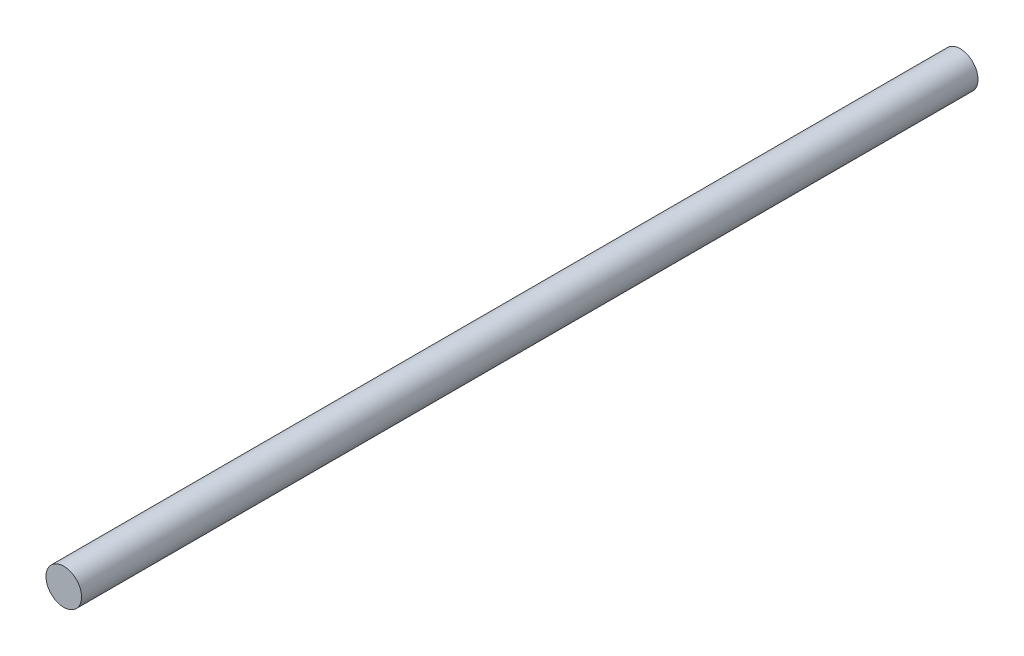
ISO-10303-21;
HEADER;
FILE_DESCRIPTION(('STEP AP214'),'2;1');
FILE_NAME('part.step','',(''),(''),'','','');
FILE_SCHEMA(('AUTOMOTIVE_DESIGN { 1 0 10303 214 1 1 1 1 }'));
ENDSEC;
DATA;
#1=APPLICATION_CONTEXT('core data for automotive mechanical design processes');
#2=APPLICATION_PROTOCOL_DEFINITION('international standard','automotive_design',2000,#1);
#3=PRODUCT_CONTEXT('',#1,'mechanical');
#4=PRODUCT('Part','Part','',(#3));
#5=PRODUCT_RELATED_PRODUCT_CATEGORY('part','',(#4));
#6=PRODUCT_DEFINITION_FORMATION('','',#4);
#7=PRODUCT_DEFINITION_CONTEXT('part definition',#1,'design');
#8=PRODUCT_DEFINITION('design','',#6,#7);
#9=PRODUCT_DEFINITION_SHAPE('','',#8);
#10=(LENGTH_UNIT() NAMED_UNIT(*) SI_UNIT(.MILLI.,.METRE.));
#11=(NAMED_UNIT(*) PLANE_ANGLE_UNIT() SI_UNIT($,.RADIAN.));
#12=(NAMED_UNIT(*) SI_UNIT($,.STERADIAN.) SOLID_ANGLE_UNIT());
#13=UNCERTAINTY_MEASURE_WITH_UNIT(LENGTH_MEASURE(1.E-05),#10,'distance_accuracy_value','');
#14=(GEOMETRIC_REPRESENTATION_CONTEXT(3) GLOBAL_UNCERTAINTY_ASSIGNED_CONTEXT((#13)) GLOBAL_UNIT_ASSIGNED_CONTEXT((#10,
#11,#12)) REPRESENTATION_CONTEXT('',''));
#15=CARTESIAN_POINT('',(0.,0.,0.));
#16=DIRECTION('',(0.,0.,1.));
#17=DIRECTION('',(1.,0.,0.));
#18=AXIS2_PLACEMENT_3D('',#15,#16,#17);
#19=CARTESIAN_POINT('',(0.,0.,151.));
#20=DIRECTION('',(0.,0.,-1.));
#21=DIRECTION('',(-1.,0.,0.));
#22=AXIS2_PLACEMENT_3D('',#19,#20,#21);
#23=CYLINDRICAL_SURFACE('',#22,3.);
#24=CARTESIAN_POINT('',(0.,0.,151.));
#25=DIRECTION('',(0.,0.,1.));
#26=DIRECTION('',(1.,0.,0.));
#27=AXIS2_PLACEMENT_3D('',#24,#25,#26);
#28=CIRCLE('',#27,3.);
#29=CARTESIAN_POINT('',(3.,0.,151.));
#30=VERTEX_POINT('',#29);
#31=EDGE_CURVE('E10',#30,#30,#28,.T.);
#32=ORIENTED_EDGE('',*,*,#31,.F.);
#33=EDGE_LOOP('',(#32));
#34=FACE_BOUND('',#33,.T.);
#35=CARTESIAN_POINT('',(0.,0.,0.));
#36=DIRECTION('',(0.,0.,1.));
#37=DIRECTION('',(1.,0.,0.));
#38=AXIS2_PLACEMENT_3D('',#35,#36,#37);
#39=CIRCLE('',#38,3.);
#40=CARTESIAN_POINT('',(3.,0.,0.));
#41=VERTEX_POINT('',#40);
#42=EDGE_CURVE('E41',#41,#41,#39,.T.);
#43=ORIENTED_EDGE('',*,*,#42,.T.);
#44=EDGE_LOOP('',(#43));
#45=FACE_BOUND('',#44,.T.);
#46=ADVANCED_FACE('F38',(#34,#45),#23,.T.);
#47=CARTESIAN_POINT('',(0.,0.,151.));
#48=DIRECTION('',(0.,0.,1.));
#49=DIRECTION('',(1.,0.,0.));
#50=AXIS2_PLACEMENT_3D('',#47,#48,#49);
#51=PLANE('',#50);
#52=ORIENTED_EDGE('',*,*,#31,.T.);
#53=EDGE_LOOP('',(#52));
#54=FACE_BOUND('',#53,.T.);
#55=ADVANCED_FACE('F53',(#54),#51,.T.);
#56=CARTESIAN_POINT('',(0.,0.,0.));
#57=DIRECTION('',(0.,0.,1.));
#58=DIRECTION('',(1.,0.,0.));
#59=AXIS2_PLACEMENT_3D('',#56,#57,#58);
#60=PLANE('',#59);
#61=ORIENTED_EDGE('',*,*,#42,.F.);
#62=EDGE_LOOP('',(#61));
#63=FACE_BOUND('',#62,.T.);
#64=ADVANCED_FACE('F51',(#63),#60,.F.);
#65=CLOSED_SHELL('',(#46,#55,#64));
#66=MANIFOLD_SOLID_BREP('B2',#65);
#67=ADVANCED_BREP_SHAPE_REPRESENTATION('',(#18,#66),#14);
#68=SHAPE_DEFINITION_REPRESENTATION(#9,#67);
ENDSEC;
END-ISO-10303-21;
